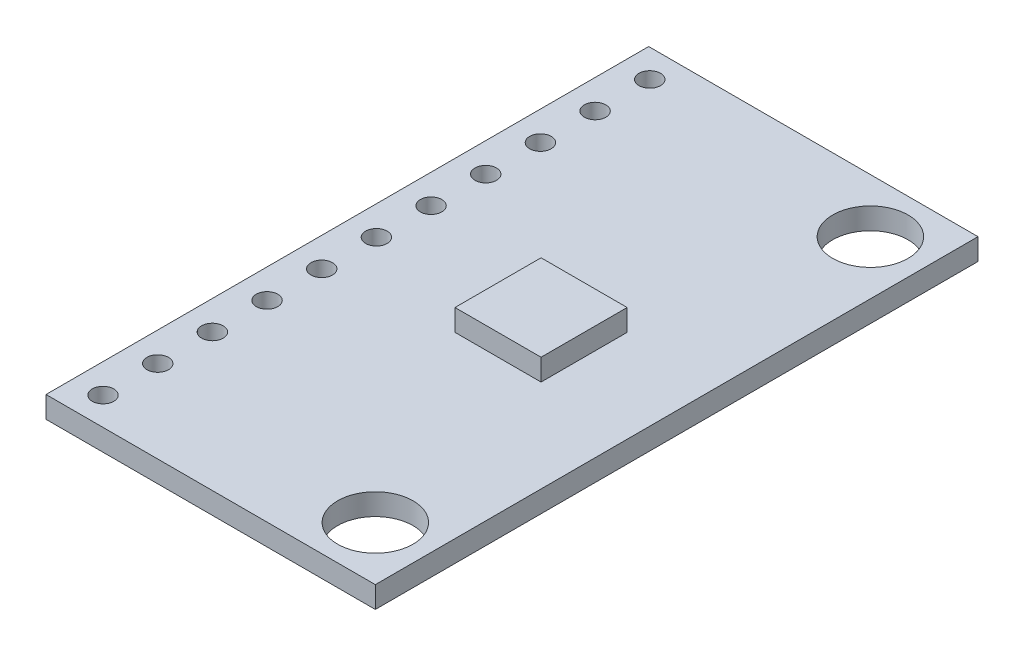
ISO-10303-21;
HEADER;
FILE_DESCRIPTION(('STEP AP214'),'2;1');
FILE_NAME('part.step','',(''),(''),'','','');
FILE_SCHEMA(('AUTOMOTIVE_DESIGN { 1 0 10303 214 1 1 1 1 }'));
ENDSEC;
DATA;
#1=APPLICATION_CONTEXT('core data for automotive mechanical design processes');
#2=APPLICATION_PROTOCOL_DEFINITION('international standard','automotive_design',2000,#1);
#3=PRODUCT_CONTEXT('',#1,'mechanical');
#4=PRODUCT('Part','Part','',(#3));
#5=PRODUCT_RELATED_PRODUCT_CATEGORY('part','',(#4));
#6=PRODUCT_DEFINITION_FORMATION('','',#4);
#7=PRODUCT_DEFINITION_CONTEXT('part definition',#1,'design');
#8=PRODUCT_DEFINITION('design','',#6,#7);
#9=PRODUCT_DEFINITION_SHAPE('','',#8);
#10=(LENGTH_UNIT() NAMED_UNIT(*) SI_UNIT(.MILLI.,.METRE.));
#11=(NAMED_UNIT(*) PLANE_ANGLE_UNIT() SI_UNIT($,.RADIAN.));
#12=(NAMED_UNIT(*) SI_UNIT($,.STERADIAN.) SOLID_ANGLE_UNIT());
#13=UNCERTAINTY_MEASURE_WITH_UNIT(LENGTH_MEASURE(1.E-05),#10,'distance_accuracy_value','');
#14=(GEOMETRIC_REPRESENTATION_CONTEXT(3) GLOBAL_UNCERTAINTY_ASSIGNED_CONTEXT((#13)) GLOBAL_UNIT_ASSIGNED_CONTEXT((#10,
#11,#12)) REPRESENTATION_CONTEXT('',''));
#15=CARTESIAN_POINT('',(0.,0.,0.));
#16=DIRECTION('',(0.,0.,1.));
#17=DIRECTION('',(1.,0.,0.));
#18=AXIS2_PLACEMENT_3D('',#15,#16,#17);
#19=CARTESIAN_POINT('',(0.,1.,0.));
#20=DIRECTION('',(0.,-1.,0.));
#21=DIRECTION('',(0.,0.,-1.));
#22=AXIS2_PLACEMENT_3D('',#19,#20,#21);
#23=PLANE('',#22);
#24=CARTESIAN_POINT('',(-7.65000000000001,1.,2.54));
#25=DIRECTION('',(0.,1.,0.));
#26=DIRECTION('',(0.,0.,-1.));
#27=AXIS2_PLACEMENT_3D('',#24,#25,#26);
#28=CIRCLE('',#27,0.500000000000001);
#29=CARTESIAN_POINT('',(-7.65000000000001,1.,2.04));
#30=VERTEX_POINT('',#29);
#31=EDGE_CURVE('E121',#30,#30,#28,.T.);
#32=ORIENTED_EDGE('',*,*,#31,.F.);
#33=EDGE_LOOP('',(#32));
#34=FACE_BOUND('',#33,.T.);
#35=CARTESIAN_POINT('',(-7.65000000000003,1.,7.62));
#36=DIRECTION('',(0.,1.,0.));
#37=DIRECTION('',(0.,0.,-1.));
#38=AXIS2_PLACEMENT_3D('',#35,#36,#37);
#39=CIRCLE('',#38,0.500000000000001);
#40=CARTESIAN_POINT('',(-7.65000000000003,1.,7.12));
#41=VERTEX_POINT('',#40);
#42=EDGE_CURVE('E136',#41,#41,#39,.T.);
#43=ORIENTED_EDGE('',*,*,#42,.F.);
#44=EDGE_LOOP('',(#43));
#45=FACE_BOUND('',#44,.T.);
#46=CARTESIAN_POINT('',(-7.65000000000005,1.,12.7));
#47=DIRECTION('',(0.,1.,0.));
#48=DIRECTION('',(0.,0.,-1.));
#49=AXIS2_PLACEMENT_3D('',#46,#47,#48);
#50=CIRCLE('',#49,0.500000000000001);
#51=CARTESIAN_POINT('',(-7.65000000000005,1.,12.2));
#52=VERTEX_POINT('',#51);
#53=EDGE_CURVE('E148',#52,#52,#50,.T.);
#54=ORIENTED_EDGE('',*,*,#53,.F.);
#55=EDGE_LOOP('',(#54));
#56=FACE_BOUND('',#55,.T.);
#57=CARTESIAN_POINT('',(-7.65000000000003,1.,-10.16));
#58=DIRECTION('',(0.,1.,0.));
#59=DIRECTION('',(0.,0.,1.));
#60=AXIS2_PLACEMENT_3D('',#57,#58,#59);
#61=CIRCLE('',#60,0.500000000000001);
#62=CARTESIAN_POINT('',(-7.65000000000003,1.,-9.66));
#63=VERTEX_POINT('',#62);
#64=EDGE_CURVE('E160',#63,#63,#61,.T.);
#65=ORIENTED_EDGE('',*,*,#64,.F.);
#66=EDGE_LOOP('',(#65));
#67=FACE_BOUND('',#66,.T.);
#68=CARTESIAN_POINT('',(-7.65000000000002,1.,-5.08));
#69=DIRECTION('',(0.,1.,0.));
#70=DIRECTION('',(0.,0.,1.));
#71=AXIS2_PLACEMENT_3D('',#68,#69,#70);
#72=CIRCLE('',#71,0.500000000000001);
#73=CARTESIAN_POINT('',(-7.65000000000002,1.,-4.58));
#74=VERTEX_POINT('',#73);
#75=EDGE_CURVE('E172',#74,#74,#72,.T.);
#76=ORIENTED_EDGE('',*,*,#75,.F.);
#77=EDGE_LOOP('',(#76));
#78=FACE_BOUND('',#77,.T.);
#79=CARTESIAN_POINT('',(-7.65,1.,0.));
#80=DIRECTION('',(0.,1.,0.));
#81=DIRECTION('',(0.,0.,1.));
#82=AXIS2_PLACEMENT_3D('',#79,#80,#81);
#83=CIRCLE('',#82,0.500000000000001);
#84=CARTESIAN_POINT('',(-7.65,1.,0.500000000000001));
#85=VERTEX_POINT('',#84);
#86=EDGE_CURVE('E184',#85,#85,#83,.T.);
#87=ORIENTED_EDGE('',*,*,#86,.F.);
#88=EDGE_LOOP('',(#87));
#89=FACE_BOUND('',#88,.T.);
#90=CARTESIAN_POINT('',(3.8,1.,-11.5));
#91=DIRECTION('',(0.,1.,0.));
#92=DIRECTION('',(0.,0.,1.));
#93=AXIS2_PLACEMENT_3D('',#90,#91,#92);
#94=CIRCLE('',#93,1.75);
#95=CARTESIAN_POINT('',(3.8,1.,-9.75));
#96=VERTEX_POINT('',#95);
#97=EDGE_CURVE('E196',#96,#96,#94,.T.);
#98=ORIENTED_EDGE('',*,*,#97,.F.);
#99=EDGE_LOOP('',(#98));
#100=FACE_BOUND('',#99,.T.);
#101=DIRECTION('',(0.,0.,-1.));
#102=VECTOR('',#101,1.);
#103=CARTESIAN_POINT('',(6.3,1.,14.));
#104=LINE('',#103,#102);
#105=CARTESIAN_POINT('',(6.3,1.,14.));
#106=VERTEX_POINT('',#105);
#107=CARTESIAN_POINT('',(6.3,1.,-14.));
#108=VERTEX_POINT('',#107);
#109=EDGE_CURVE('E202',#106,#108,#104,.T.);
#110=ORIENTED_EDGE('',*,*,#109,.T.);
#111=DIRECTION('',(-1.,0.,0.));
#112=VECTOR('',#111,1.);
#113=CARTESIAN_POINT('',(-9.,1.,-14.));
#114=LINE('',#113,#112);
#115=CARTESIAN_POINT('',(-9.,1.,-14.));
#116=VERTEX_POINT('',#115);
#117=EDGE_CURVE('E205',#108,#116,#114,.T.);
#118=ORIENTED_EDGE('',*,*,#117,.T.);
#119=DIRECTION('',(0.,0.,1.));
#120=VECTOR('',#119,1.);
#121=CARTESIAN_POINT('',(-9.,1.,14.));
#122=LINE('',#121,#120);
#123=CARTESIAN_POINT('',(-9.,1.,14.));
#124=VERTEX_POINT('',#123);
#125=EDGE_CURVE('E208',#116,#124,#122,.T.);
#126=ORIENTED_EDGE('',*,*,#125,.T.);
#127=DIRECTION('',(1.,0.,0.));
#128=VECTOR('',#127,1.);
#129=CARTESIAN_POINT('',(-9.,1.,14.));
#130=LINE('',#129,#128);
#131=EDGE_CURVE('E210',#124,#106,#130,.T.);
#132=ORIENTED_EDGE('',*,*,#131,.T.);
#133=EDGE_LOOP('',(#110,#118,#126,#132));
#134=FACE_BOUND('',#133,.T.);
#135=CARTESIAN_POINT('',(3.79999999999999,1.,11.5));
#136=DIRECTION('',(0.,1.,0.));
#137=DIRECTION('',(0.,0.,-1.));
#138=AXIS2_PLACEMENT_3D('',#135,#136,#137);
#139=CIRCLE('',#138,1.75);
#140=CARTESIAN_POINT('',(3.79999999999999,1.,9.75));
#141=VERTEX_POINT('',#140);
#142=EDGE_CURVE('E190',#141,#141,#139,.T.);
#143=ORIENTED_EDGE('',*,*,#142,.F.);
#144=EDGE_LOOP('',(#143));
#145=FACE_BOUND('',#144,.T.);
#146=CARTESIAN_POINT('',(-7.65000000000001,1.,-2.54));
#147=DIRECTION('',(0.,1.,0.));
#148=DIRECTION('',(0.,0.,1.));
#149=AXIS2_PLACEMENT_3D('',#146,#147,#148);
#150=CIRCLE('',#149,0.500000000000001);
#151=CARTESIAN_POINT('',(-7.65000000000001,1.,-2.04));
#152=VERTEX_POINT('',#151);
#153=EDGE_CURVE('E178',#152,#152,#150,.T.);
#154=ORIENTED_EDGE('',*,*,#153,.F.);
#155=EDGE_LOOP('',(#154));
#156=FACE_BOUND('',#155,.T.);
#157=CARTESIAN_POINT('',(-7.65000000000003,1.,-7.62));
#158=DIRECTION('',(0.,1.,0.));
#159=DIRECTION('',(0.,0.,1.));
#160=AXIS2_PLACEMENT_3D('',#157,#158,#159);
#161=CIRCLE('',#160,0.500000000000001);
#162=CARTESIAN_POINT('',(-7.65000000000003,1.,-7.12));
#163=VERTEX_POINT('',#162);
#164=EDGE_CURVE('E166',#163,#163,#161,.T.);
#165=ORIENTED_EDGE('',*,*,#164,.F.);
#166=EDGE_LOOP('',(#165));
#167=FACE_BOUND('',#166,.T.);
#168=CARTESIAN_POINT('',(-7.65000000000004,1.,-12.7));
#169=DIRECTION('',(0.,1.,0.));
#170=DIRECTION('',(0.,0.,1.));
#171=AXIS2_PLACEMENT_3D('',#168,#169,#170);
#172=CIRCLE('',#171,0.500000000000001);
#173=CARTESIAN_POINT('',(-7.65000000000004,1.,-12.2));
#174=VERTEX_POINT('',#173);
#175=EDGE_CURVE('E154',#174,#174,#172,.T.);
#176=ORIENTED_EDGE('',*,*,#175,.F.);
#177=EDGE_LOOP('',(#176));
#178=FACE_BOUND('',#177,.T.);
#179=CARTESIAN_POINT('',(-7.65000000000004,1.,10.16));
#180=DIRECTION('',(0.,1.,0.));
#181=DIRECTION('',(0.,0.,-1.));
#182=AXIS2_PLACEMENT_3D('',#179,#180,#181);
#183=CIRCLE('',#182,0.500000000000001);
#184=CARTESIAN_POINT('',(-7.65000000000004,1.,9.66));
#185=VERTEX_POINT('',#184);
#186=EDGE_CURVE('E142',#185,#185,#183,.T.);
#187=ORIENTED_EDGE('',*,*,#186,.F.);
#188=EDGE_LOOP('',(#187));
#189=FACE_BOUND('',#188,.T.);
#190=CARTESIAN_POINT('',(-7.65000000000002,1.,5.08));
#191=DIRECTION('',(0.,1.,0.));
#192=DIRECTION('',(0.,0.,-1.));
#193=AXIS2_PLACEMENT_3D('',#190,#191,#192);
#194=CIRCLE('',#193,0.500000000000001);
#195=CARTESIAN_POINT('',(-7.65000000000002,1.,4.58));
#196=VERTEX_POINT('',#195);
#197=EDGE_CURVE('E130',#196,#196,#194,.T.);
#198=ORIENTED_EDGE('',*,*,#197,.F.);
#199=EDGE_LOOP('',(#198));
#200=FACE_BOUND('',#199,.T.);
#201=DIRECTION('',(0.,0.,-1.));
#202=VECTOR('',#201,1.);
#203=CARTESIAN_POINT('',(2.,1.,-2.));
#204=LINE('',#203,#202);
#205=CARTESIAN_POINT('',(2.,1.,2.));
#206=VERTEX_POINT('',#205);
#207=CARTESIAN_POINT('',(2.,1.,-2.));
#208=VERTEX_POINT('',#207);
#209=EDGE_CURVE('E117',#206,#208,#204,.T.);
#210=ORIENTED_EDGE('',*,*,#209,.F.);
#211=DIRECTION('',(1.,0.,0.));
#212=VECTOR('',#211,1.);
#213=CARTESIAN_POINT('',(-2.,1.,2.));
#214=LINE('',#213,#212);
#215=CARTESIAN_POINT('',(-2.,1.,2.));
#216=VERTEX_POINT('',#215);
#217=EDGE_CURVE('E114',#216,#206,#214,.T.);
#218=ORIENTED_EDGE('',*,*,#217,.F.);
#219=DIRECTION('',(0.,0.,1.));
#220=VECTOR('',#219,1.);
#221=CARTESIAN_POINT('',(-2.,1.,-2.));
#222=LINE('',#221,#220);
#223=CARTESIAN_POINT('',(-2.,1.,-2.));
#224=VERTEX_POINT('',#223);
#225=EDGE_CURVE('E52',#224,#216,#222,.T.);
#226=ORIENTED_EDGE('',*,*,#225,.F.);
#227=DIRECTION('',(-1.,0.,0.));
#228=VECTOR('',#227,1.);
#229=CARTESIAN_POINT('',(-2.,1.,-2.));
#230=LINE('',#229,#228);
#231=EDGE_CURVE('E47',#208,#224,#230,.T.);
#232=ORIENTED_EDGE('',*,*,#231,.F.);
#233=EDGE_LOOP('',(#210,#218,#226,#232));
#234=FACE_BOUND('',#233,.T.);
#235=ADVANCED_FACE('F32',(#34,#45,#56,#67,#78,#89,#100,#134,#145,#156,#167,#178,#189,#200,#234),
#23,.F.);
#236=CARTESIAN_POINT('',(0.,0.,0.));
#237=DIRECTION('',(0.,-1.,0.));
#238=DIRECTION('',(0.,0.,-1.));
#239=AXIS2_PLACEMENT_3D('',#236,#237,#238);
#240=PLANE('',#239);
#241=CARTESIAN_POINT('',(-7.65000000000002,0.,5.08));
#242=DIRECTION('',(0.,1.,0.));
#243=DIRECTION('',(0.,0.,-1.));
#244=AXIS2_PLACEMENT_3D('',#241,#242,#243);
#245=CIRCLE('',#244,0.500000000000001);
#246=CARTESIAN_POINT('',(-7.65000000000002,0.,4.58));
#247=VERTEX_POINT('',#246);
#248=EDGE_CURVE('E128',#247,#247,#245,.T.);
#249=ORIENTED_EDGE('',*,*,#248,.T.);
#250=EDGE_LOOP('',(#249));
#251=FACE_BOUND('',#250,.T.);
#252=CARTESIAN_POINT('',(-7.65000000000004,0.,10.16));
#253=DIRECTION('',(0.,1.,0.));
#254=DIRECTION('',(0.,0.,-1.));
#255=AXIS2_PLACEMENT_3D('',#252,#253,#254);
#256=CIRCLE('',#255,0.500000000000001);
#257=CARTESIAN_POINT('',(-7.65000000000004,0.,9.66));
#258=VERTEX_POINT('',#257);
#259=EDGE_CURVE('E139',#258,#258,#256,.T.);
#260=ORIENTED_EDGE('',*,*,#259,.T.);
#261=EDGE_LOOP('',(#260));
#262=FACE_BOUND('',#261,.T.);
#263=CARTESIAN_POINT('',(-7.65000000000004,0.,-12.7));
#264=DIRECTION('',(0.,1.,0.));
#265=DIRECTION('',(0.,0.,1.));
#266=AXIS2_PLACEMENT_3D('',#263,#264,#265);
#267=CIRCLE('',#266,0.500000000000001);
#268=CARTESIAN_POINT('',(-7.65000000000004,0.,-12.2));
#269=VERTEX_POINT('',#268);
#270=EDGE_CURVE('E151',#269,#269,#267,.T.);
#271=ORIENTED_EDGE('',*,*,#270,.T.);
#272=EDGE_LOOP('',(#271));
#273=FACE_BOUND('',#272,.T.);
#274=CARTESIAN_POINT('',(-7.65000000000003,0.,-7.62));
#275=DIRECTION('',(0.,1.,0.));
#276=DIRECTION('',(0.,0.,1.));
#277=AXIS2_PLACEMENT_3D('',#274,#275,#276);
#278=CIRCLE('',#277,0.500000000000001);
#279=CARTESIAN_POINT('',(-7.65000000000003,0.,-7.12));
#280=VERTEX_POINT('',#279);
#281=EDGE_CURVE('E163',#280,#280,#278,.T.);
#282=ORIENTED_EDGE('',*,*,#281,.T.);
#283=EDGE_LOOP('',(#282));
#284=FACE_BOUND('',#283,.T.);
#285=CARTESIAN_POINT('',(-7.65000000000001,0.,-2.54));
#286=DIRECTION('',(0.,1.,0.));
#287=DIRECTION('',(0.,0.,1.));
#288=AXIS2_PLACEMENT_3D('',#285,#286,#287);
#289=CIRCLE('',#288,0.500000000000001);
#290=CARTESIAN_POINT('',(-7.65000000000001,0.,-2.04));
#291=VERTEX_POINT('',#290);
#292=EDGE_CURVE('E175',#291,#291,#289,.T.);
#293=ORIENTED_EDGE('',*,*,#292,.T.);
#294=EDGE_LOOP('',(#293));
#295=FACE_BOUND('',#294,.T.);
#296=CARTESIAN_POINT('',(3.79999999999999,0.,11.5));
#297=DIRECTION('',(0.,1.,0.));
#298=DIRECTION('',(0.,0.,-1.));
#299=AXIS2_PLACEMENT_3D('',#296,#297,#298);
#300=CIRCLE('',#299,1.75);
#301=CARTESIAN_POINT('',(3.79999999999999,0.,9.75));
#302=VERTEX_POINT('',#301);
#303=EDGE_CURVE('E187',#302,#302,#300,.T.);
#304=ORIENTED_EDGE('',*,*,#303,.T.);
#305=EDGE_LOOP('',(#304));
#306=FACE_BOUND('',#305,.T.);
#307=DIRECTION('',(0.,0.,-1.));
#308=VECTOR('',#307,1.);
#309=CARTESIAN_POINT('',(6.3,0.,14.));
#310=LINE('',#309,#308);
#311=CARTESIAN_POINT('',(6.3,0.,14.));
#312=VERTEX_POINT('',#311);
#313=CARTESIAN_POINT('',(6.3,0.,-14.));
#314=VERTEX_POINT('',#313);
#315=EDGE_CURVE('E199',#312,#314,#310,.T.);
#316=ORIENTED_EDGE('',*,*,#315,.F.);
#317=DIRECTION('',(1.,0.,0.));
#318=VECTOR('',#317,1.);
#319=CARTESIAN_POINT('',(-9.,0.,14.));
#320=LINE('',#319,#318);
#321=CARTESIAN_POINT('',(-9.,0.,14.));
#322=VERTEX_POINT('',#321);
#323=EDGE_CURVE('E206',#322,#312,#320,.T.);
#324=ORIENTED_EDGE('',*,*,#323,.F.);
#325=DIRECTION('',(0.,0.,1.));
#326=VECTOR('',#325,1.);
#327=CARTESIAN_POINT('',(-9.,0.,14.));
#328=LINE('',#327,#326);
#329=CARTESIAN_POINT('',(-9.,0.,-14.));
#330=VERTEX_POINT('',#329);
#331=EDGE_CURVE('E217',#330,#322,#328,.T.);
#332=ORIENTED_EDGE('',*,*,#331,.F.);
#333=DIRECTION('',(-1.,0.,0.));
#334=VECTOR('',#333,1.);
#335=CARTESIAN_POINT('',(-9.,0.,-14.));
#336=LINE('',#335,#334);
#337=EDGE_CURVE('E215',#314,#330,#336,.T.);
#338=ORIENTED_EDGE('',*,*,#337,.F.);
#339=EDGE_LOOP('',(#316,#324,#332,#338));
#340=FACE_BOUND('',#339,.T.);
#341=CARTESIAN_POINT('',(3.8,0.,-11.5));
#342=DIRECTION('',(0.,1.,0.));
#343=DIRECTION('',(0.,0.,1.));
#344=AXIS2_PLACEMENT_3D('',#341,#342,#343);
#345=CIRCLE('',#344,1.75);
#346=CARTESIAN_POINT('',(3.8,0.,-9.75));
#347=VERTEX_POINT('',#346);
#348=EDGE_CURVE('E193',#347,#347,#345,.T.);
#349=ORIENTED_EDGE('',*,*,#348,.T.);
#350=EDGE_LOOP('',(#349));
#351=FACE_BOUND('',#350,.T.);
#352=CARTESIAN_POINT('',(-7.65,0.,0.));
#353=DIRECTION('',(0.,1.,0.));
#354=DIRECTION('',(0.,0.,1.));
#355=AXIS2_PLACEMENT_3D('',#352,#353,#354);
#356=CIRCLE('',#355,0.500000000000001);
#357=CARTESIAN_POINT('',(-7.65,0.,0.500000000000001));
#358=VERTEX_POINT('',#357);
#359=EDGE_CURVE('E181',#358,#358,#356,.T.);
#360=ORIENTED_EDGE('',*,*,#359,.T.);
#361=EDGE_LOOP('',(#360));
#362=FACE_BOUND('',#361,.T.);
#363=CARTESIAN_POINT('',(-7.65000000000002,0.,-5.08));
#364=DIRECTION('',(0.,1.,0.));
#365=DIRECTION('',(0.,0.,1.));
#366=AXIS2_PLACEMENT_3D('',#363,#364,#365);
#367=CIRCLE('',#366,0.500000000000001);
#368=CARTESIAN_POINT('',(-7.65000000000002,0.,-4.58));
#369=VERTEX_POINT('',#368);
#370=EDGE_CURVE('E169',#369,#369,#367,.T.);
#371=ORIENTED_EDGE('',*,*,#370,.T.);
#372=EDGE_LOOP('',(#371));
#373=FACE_BOUND('',#372,.T.);
#374=CARTESIAN_POINT('',(-7.65000000000003,0.,-10.16));
#375=DIRECTION('',(0.,1.,0.));
#376=DIRECTION('',(0.,0.,1.));
#377=AXIS2_PLACEMENT_3D('',#374,#375,#376);
#378=CIRCLE('',#377,0.500000000000001);
#379=CARTESIAN_POINT('',(-7.65000000000003,0.,-9.66));
#380=VERTEX_POINT('',#379);
#381=EDGE_CURVE('E157',#380,#380,#378,.T.);
#382=ORIENTED_EDGE('',*,*,#381,.T.);
#383=EDGE_LOOP('',(#382));
#384=FACE_BOUND('',#383,.T.);
#385=CARTESIAN_POINT('',(-7.65000000000005,0.,12.7));
#386=DIRECTION('',(0.,1.,0.));
#387=DIRECTION('',(0.,0.,-1.));
#388=AXIS2_PLACEMENT_3D('',#385,#386,#387);
#389=CIRCLE('',#388,0.500000000000001);
#390=CARTESIAN_POINT('',(-7.65000000000005,0.,12.2));
#391=VERTEX_POINT('',#390);
#392=EDGE_CURVE('E145',#391,#391,#389,.T.);
#393=ORIENTED_EDGE('',*,*,#392,.T.);
#394=EDGE_LOOP('',(#393));
#395=FACE_BOUND('',#394,.T.);
#396=CARTESIAN_POINT('',(-7.65000000000003,0.,7.62));
#397=DIRECTION('',(0.,1.,0.));
#398=DIRECTION('',(0.,0.,-1.));
#399=AXIS2_PLACEMENT_3D('',#396,#397,#398);
#400=CIRCLE('',#399,0.500000000000001);
#401=CARTESIAN_POINT('',(-7.65000000000003,0.,7.12));
#402=VERTEX_POINT('',#401);
#403=EDGE_CURVE('E133',#402,#402,#400,.T.);
#404=ORIENTED_EDGE('',*,*,#403,.T.);
#405=EDGE_LOOP('',(#404));
#406=FACE_BOUND('',#405,.T.);
#407=CARTESIAN_POINT('',(-7.65000000000001,0.,2.54));
#408=DIRECTION('',(0.,1.,0.));
#409=DIRECTION('',(0.,0.,-1.));
#410=AXIS2_PLACEMENT_3D('',#407,#408,#409);
#411=CIRCLE('',#410,0.500000000000001);
#412=CARTESIAN_POINT('',(-7.65000000000001,0.,2.04));
#413=VERTEX_POINT('',#412);
#414=EDGE_CURVE('E118',#413,#413,#411,.T.);
#415=ORIENTED_EDGE('',*,*,#414,.T.);
#416=EDGE_LOOP('',(#415));
#417=FACE_BOUND('',#416,.T.);
#418=ADVANCED_FACE('F235',(#251,#262,#273,#284,#295,#306,#340,#351,#362,#373,#384,#395,#406,
#417),#240,.T.);
#419=CARTESIAN_POINT('',(6.3,1.,14.));
#420=DIRECTION('',(-1.,0.,0.));
#421=DIRECTION('',(0.,0.,1.));
#422=AXIS2_PLACEMENT_3D('',#419,#420,#421);
#423=PLANE('',#422);
#424=ORIENTED_EDGE('',*,*,#315,.T.);
#425=DIRECTION('',(0.,-1.,0.));
#426=VECTOR('',#425,1.);
#427=CARTESIAN_POINT('',(6.3,1.,-14.));
#428=LINE('',#427,#426);
#429=EDGE_CURVE('E11',#108,#314,#428,.T.);
#430=ORIENTED_EDGE('',*,*,#429,.F.);
#431=ORIENTED_EDGE('',*,*,#109,.F.);
#432=DIRECTION('',(0.,-1.,0.));
#433=VECTOR('',#432,1.);
#434=CARTESIAN_POINT('',(6.3,1.,14.));
#435=LINE('',#434,#433);
#436=EDGE_CURVE('E212',#106,#312,#435,.T.);
#437=ORIENTED_EDGE('',*,*,#436,.T.);
#438=EDGE_LOOP('',(#424,#430,#431,#437));
#439=FACE_BOUND('',#438,.T.);
#440=ADVANCED_FACE('F34',(#439),#423,.F.);
#441=CARTESIAN_POINT('',(-9.,1.,-14.));
#442=DIRECTION('',(0.,0.,1.));
#443=DIRECTION('',(1.,0.,0.));
#444=AXIS2_PLACEMENT_3D('',#441,#442,#443);
#445=PLANE('',#444);
#446=ORIENTED_EDGE('',*,*,#337,.T.);
#447=DIRECTION('',(0.,-1.,0.));
#448=VECTOR('',#447,1.);
#449=CARTESIAN_POINT('',(-9.,1.,-14.));
#450=LINE('',#449,#448);
#451=EDGE_CURVE('E40',#116,#330,#450,.T.);
#452=ORIENTED_EDGE('',*,*,#451,.F.);
#453=ORIENTED_EDGE('',*,*,#117,.F.);
#454=ORIENTED_EDGE('',*,*,#429,.T.);
#455=EDGE_LOOP('',(#446,#452,#453,#454));
#456=FACE_BOUND('',#455,.T.);
#457=ADVANCED_FACE('F246',(#456),#445,.F.);
#458=CARTESIAN_POINT('',(-9.,1.,14.));
#459=DIRECTION('',(1.,0.,0.));
#460=DIRECTION('',(0.,0.,-1.));
#461=AXIS2_PLACEMENT_3D('',#458,#459,#460);
#462=PLANE('',#461);
#463=ORIENTED_EDGE('',*,*,#331,.T.);
#464=DIRECTION('',(0.,-1.,0.));
#465=VECTOR('',#464,1.);
#466=CARTESIAN_POINT('',(-9.,1.,14.));
#467=LINE('',#466,#465);
#468=EDGE_CURVE('E222',#124,#322,#467,.T.);
#469=ORIENTED_EDGE('',*,*,#468,.F.);
#470=ORIENTED_EDGE('',*,*,#125,.F.);
#471=ORIENTED_EDGE('',*,*,#451,.T.);
#472=EDGE_LOOP('',(#463,#469,#470,#471));
#473=FACE_BOUND('',#472,.T.);
#474=ADVANCED_FACE('F229',(#473),#462,.F.);
#475=CARTESIAN_POINT('',(-9.,1.,14.));
#476=DIRECTION('',(0.,0.,-1.));
#477=DIRECTION('',(-1.,0.,0.));
#478=AXIS2_PLACEMENT_3D('',#475,#476,#477);
#479=PLANE('',#478);
#480=ORIENTED_EDGE('',*,*,#323,.T.);
#481=ORIENTED_EDGE('',*,*,#436,.F.);
#482=ORIENTED_EDGE('',*,*,#131,.F.);
#483=ORIENTED_EDGE('',*,*,#468,.T.);
#484=EDGE_LOOP('',(#480,#481,#482,#483));
#485=FACE_BOUND('',#484,.T.);
#486=ADVANCED_FACE('F239',(#485),#479,.F.);
#487=CARTESIAN_POINT('',(3.8,1.,-11.5));
#488=DIRECTION('',(0.,-1.,0.));
#489=DIRECTION('',(0.,0.,-1.));
#490=AXIS2_PLACEMENT_3D('',#487,#488,#489);
#491=CYLINDRICAL_SURFACE('',#490,1.75);
#492=ORIENTED_EDGE('',*,*,#97,.T.);
#493=EDGE_LOOP('',(#492));
#494=FACE_BOUND('',#493,.T.);
#495=ORIENTED_EDGE('',*,*,#348,.F.);
#496=EDGE_LOOP('',(#495));
#497=FACE_BOUND('',#496,.T.);
#498=ADVANCED_FACE('F264',(#494,#497),#491,.F.);
#499=CARTESIAN_POINT('',(3.79999999999999,1.,11.5));
#500=DIRECTION('',(0.,-1.,0.));
#501=DIRECTION('',(0.,0.,-1.));
#502=AXIS2_PLACEMENT_3D('',#499,#500,#501);
#503=CYLINDRICAL_SURFACE('',#502,1.75);
#504=ORIENTED_EDGE('',*,*,#142,.T.);
#505=EDGE_LOOP('',(#504));
#506=FACE_BOUND('',#505,.T.);
#507=ORIENTED_EDGE('',*,*,#303,.F.);
#508=EDGE_LOOP('',(#507));
#509=FACE_BOUND('',#508,.T.);
#510=ADVANCED_FACE('F271',(#506,#509),#503,.F.);
#511=CARTESIAN_POINT('',(-7.65,1.,0.));
#512=DIRECTION('',(0.,-1.,0.));
#513=DIRECTION('',(0.,0.,-1.));
#514=AXIS2_PLACEMENT_3D('',#511,#512,#513);
#515=CYLINDRICAL_SURFACE('',#514,0.500000000000001);
#516=ORIENTED_EDGE('',*,*,#86,.T.);
#517=EDGE_LOOP('',(#516));
#518=FACE_BOUND('',#517,.T.);
#519=ORIENTED_EDGE('',*,*,#359,.F.);
#520=EDGE_LOOP('',(#519));
#521=FACE_BOUND('',#520,.T.);
#522=ADVANCED_FACE('F276',(#518,#521),#515,.F.);
#523=CARTESIAN_POINT('',(-7.65000000000001,1.,-2.54));
#524=DIRECTION('',(0.,-1.,0.));
#525=DIRECTION('',(0.,0.,-1.));
#526=AXIS2_PLACEMENT_3D('',#523,#524,#525);
#527=CYLINDRICAL_SURFACE('',#526,0.500000000000001);
#528=ORIENTED_EDGE('',*,*,#153,.T.);
#529=EDGE_LOOP('',(#528));
#530=FACE_BOUND('',#529,.T.);
#531=ORIENTED_EDGE('',*,*,#292,.F.);
#532=EDGE_LOOP('',(#531));
#533=FACE_BOUND('',#532,.T.);
#534=ADVANCED_FACE('F335',(#530,#533),#527,.F.);
#535=CARTESIAN_POINT('',(-7.65000000000002,1.,-5.08));
#536=DIRECTION('',(0.,-1.,0.));
#537=DIRECTION('',(0.,0.,-1.));
#538=AXIS2_PLACEMENT_3D('',#535,#536,#537);
#539=CYLINDRICAL_SURFACE('',#538,0.500000000000001);
#540=ORIENTED_EDGE('',*,*,#75,.T.);
#541=EDGE_LOOP('',(#540));
#542=FACE_BOUND('',#541,.T.);
#543=ORIENTED_EDGE('',*,*,#370,.F.);
#544=EDGE_LOOP('',(#543));
#545=FACE_BOUND('',#544,.T.);
#546=ADVANCED_FACE('F331',(#542,#545),#539,.F.);
#547=CARTESIAN_POINT('',(-7.65000000000003,1.,-7.62));
#548=DIRECTION('',(0.,-1.,0.));
#549=DIRECTION('',(0.,0.,-1.));
#550=AXIS2_PLACEMENT_3D('',#547,#548,#549);
#551=CYLINDRICAL_SURFACE('',#550,0.500000000000001);
#552=ORIENTED_EDGE('',*,*,#164,.T.);
#553=EDGE_LOOP('',(#552));
#554=FACE_BOUND('',#553,.T.);
#555=ORIENTED_EDGE('',*,*,#281,.F.);
#556=EDGE_LOOP('',(#555));
#557=FACE_BOUND('',#556,.T.);
#558=ADVANCED_FACE('F327',(#554,#557),#551,.F.);
#559=CARTESIAN_POINT('',(-7.65000000000003,1.,-10.16));
#560=DIRECTION('',(0.,-1.,0.));
#561=DIRECTION('',(0.,0.,-1.));
#562=AXIS2_PLACEMENT_3D('',#559,#560,#561);
#563=CYLINDRICAL_SURFACE('',#562,0.500000000000001);
#564=ORIENTED_EDGE('',*,*,#64,.T.);
#565=EDGE_LOOP('',(#564));
#566=FACE_BOUND('',#565,.T.);
#567=ORIENTED_EDGE('',*,*,#381,.F.);
#568=EDGE_LOOP('',(#567));
#569=FACE_BOUND('',#568,.T.);
#570=ADVANCED_FACE('F323',(#566,#569),#563,.F.);
#571=CARTESIAN_POINT('',(-7.65000000000004,1.,-12.7));
#572=DIRECTION('',(0.,-1.,0.));
#573=DIRECTION('',(0.,0.,-1.));
#574=AXIS2_PLACEMENT_3D('',#571,#572,#573);
#575=CYLINDRICAL_SURFACE('',#574,0.500000000000001);
#576=ORIENTED_EDGE('',*,*,#175,.T.);
#577=EDGE_LOOP('',(#576));
#578=FACE_BOUND('',#577,.T.);
#579=ORIENTED_EDGE('',*,*,#270,.F.);
#580=EDGE_LOOP('',(#579));
#581=FACE_BOUND('',#580,.T.);
#582=ADVANCED_FACE('F319',(#578,#581),#575,.F.);
#583=CARTESIAN_POINT('',(-7.65000000000005,1.,12.7));
#584=DIRECTION('',(0.,-1.,0.));
#585=DIRECTION('',(0.,0.,-1.));
#586=AXIS2_PLACEMENT_3D('',#583,#584,#585);
#587=CYLINDRICAL_SURFACE('',#586,0.500000000000001);
#588=ORIENTED_EDGE('',*,*,#53,.T.);
#589=EDGE_LOOP('',(#588));
#590=FACE_BOUND('',#589,.T.);
#591=ORIENTED_EDGE('',*,*,#392,.F.);
#592=EDGE_LOOP('',(#591));
#593=FACE_BOUND('',#592,.T.);
#594=ADVANCED_FACE('F315',(#590,#593),#587,.F.);
#595=CARTESIAN_POINT('',(-7.65000000000004,1.,10.16));
#596=DIRECTION('',(0.,-1.,0.));
#597=DIRECTION('',(0.,0.,-1.));
#598=AXIS2_PLACEMENT_3D('',#595,#596,#597);
#599=CYLINDRICAL_SURFACE('',#598,0.500000000000001);
#600=ORIENTED_EDGE('',*,*,#186,.T.);
#601=EDGE_LOOP('',(#600));
#602=FACE_BOUND('',#601,.T.);
#603=ORIENTED_EDGE('',*,*,#259,.F.);
#604=EDGE_LOOP('',(#603));
#605=FACE_BOUND('',#604,.T.);
#606=ADVANCED_FACE('F311',(#602,#605),#599,.F.);
#607=CARTESIAN_POINT('',(-7.65000000000003,1.,7.62));
#608=DIRECTION('',(0.,-1.,0.));
#609=DIRECTION('',(0.,0.,-1.));
#610=AXIS2_PLACEMENT_3D('',#607,#608,#609);
#611=CYLINDRICAL_SURFACE('',#610,0.500000000000001);
#612=ORIENTED_EDGE('',*,*,#42,.T.);
#613=EDGE_LOOP('',(#612));
#614=FACE_BOUND('',#613,.T.);
#615=ORIENTED_EDGE('',*,*,#403,.F.);
#616=EDGE_LOOP('',(#615));
#617=FACE_BOUND('',#616,.T.);
#618=ADVANCED_FACE('F304',(#614,#617),#611,.F.);
#619=CARTESIAN_POINT('',(-7.65000000000002,1.,5.08));
#620=DIRECTION('',(0.,-1.,0.));
#621=DIRECTION('',(0.,0.,-1.));
#622=AXIS2_PLACEMENT_3D('',#619,#620,#621);
#623=CYLINDRICAL_SURFACE('',#622,0.500000000000001);
#624=ORIENTED_EDGE('',*,*,#197,.T.);
#625=EDGE_LOOP('',(#624));
#626=FACE_BOUND('',#625,.T.);
#627=ORIENTED_EDGE('',*,*,#248,.F.);
#628=EDGE_LOOP('',(#627));
#629=FACE_BOUND('',#628,.T.);
#630=ADVANCED_FACE('F296',(#626,#629),#623,.F.);
#631=CARTESIAN_POINT('',(-7.65000000000001,1.,2.54));
#632=DIRECTION('',(0.,-1.,0.));
#633=DIRECTION('',(0.,0.,-1.));
#634=AXIS2_PLACEMENT_3D('',#631,#632,#633);
#635=CYLINDRICAL_SURFACE('',#634,0.500000000000001);
#636=ORIENTED_EDGE('',*,*,#31,.T.);
#637=EDGE_LOOP('',(#636));
#638=FACE_BOUND('',#637,.T.);
#639=ORIENTED_EDGE('',*,*,#414,.F.);
#640=EDGE_LOOP('',(#639));
#641=FACE_BOUND('',#640,.T.);
#642=ADVANCED_FACE('F294',(#638,#641),#635,.F.);
#643=CARTESIAN_POINT('',(2.,2.,-2.));
#644=DIRECTION('',(-1.,0.,0.));
#645=DIRECTION('',(0.,0.,1.));
#646=AXIS2_PLACEMENT_3D('',#643,#644,#645);
#647=PLANE('',#646);
#648=ORIENTED_EDGE('',*,*,#209,.T.);
#649=DIRECTION('',(0.,-1.,0.));
#650=VECTOR('',#649,1.);
#651=CARTESIAN_POINT('',(2.,2.,-2.));
#652=LINE('',#651,#650);
#653=CARTESIAN_POINT('',(2.,2.,-2.));
#654=VERTEX_POINT('',#653);
#655=EDGE_CURVE('E98',#654,#208,#652,.T.);
#656=ORIENTED_EDGE('',*,*,#655,.F.);
#657=DIRECTION('',(0.,0.,-1.));
#658=VECTOR('',#657,1.);
#659=CARTESIAN_POINT('',(2.,2.,-2.));
#660=LINE('',#659,#658);
#661=CARTESIAN_POINT('',(2.,2.,2.));
#662=VERTEX_POINT('',#661);
#663=EDGE_CURVE('E105',#662,#654,#660,.T.);
#664=ORIENTED_EDGE('',*,*,#663,.F.);
#665=DIRECTION('',(0.,-1.,0.));
#666=VECTOR('',#665,1.);
#667=CARTESIAN_POINT('',(2.,2.,2.));
#668=LINE('',#667,#666);
#669=EDGE_CURVE('E441',#662,#206,#668,.T.);
#670=ORIENTED_EDGE('',*,*,#669,.T.);
#671=EDGE_LOOP('',(#648,#656,#664,#670));
#672=FACE_BOUND('',#671,.T.);
#673=ADVANCED_FACE('F116',(#672),#647,.F.);
#674=CARTESIAN_POINT('',(-2.,2.,-2.));
#675=DIRECTION('',(0.,0.,1.));
#676=DIRECTION('',(1.,0.,0.));
#677=AXIS2_PLACEMENT_3D('',#674,#675,#676);
#678=PLANE('',#677);
#679=ORIENTED_EDGE('',*,*,#231,.T.);
#680=DIRECTION('',(0.,-1.,0.));
#681=VECTOR('',#680,1.);
#682=CARTESIAN_POINT('',(-2.,2.,-2.));
#683=LINE('',#682,#681);
#684=CARTESIAN_POINT('',(-2.,2.,-2.));
#685=VERTEX_POINT('',#684);
#686=EDGE_CURVE('E101',#685,#224,#683,.T.);
#687=ORIENTED_EDGE('',*,*,#686,.F.);
#688=DIRECTION('',(-1.,0.,0.));
#689=VECTOR('',#688,1.);
#690=CARTESIAN_POINT('',(-2.,2.,-2.));
#691=LINE('',#690,#689);
#692=EDGE_CURVE('E94',#654,#685,#691,.T.);
#693=ORIENTED_EDGE('',*,*,#692,.F.);
#694=ORIENTED_EDGE('',*,*,#655,.T.);
#695=EDGE_LOOP('',(#679,#687,#693,#694));
#696=FACE_BOUND('',#695,.T.);
#697=ADVANCED_FACE('F96',(#696),#678,.F.);
#698=CARTESIAN_POINT('',(-2.,2.,-2.));
#699=DIRECTION('',(1.,0.,0.));
#700=DIRECTION('',(0.,0.,-1.));
#701=AXIS2_PLACEMENT_3D('',#698,#699,#700);
#702=PLANE('',#701);
#703=ORIENTED_EDGE('',*,*,#225,.T.);
#704=DIRECTION('',(0.,-1.,0.));
#705=VECTOR('',#704,1.);
#706=CARTESIAN_POINT('',(-2.,2.,2.));
#707=LINE('',#706,#705);
#708=CARTESIAN_POINT('',(-2.,2.,2.));
#709=VERTEX_POINT('',#708);
#710=EDGE_CURVE('E123',#709,#216,#707,.T.);
#711=ORIENTED_EDGE('',*,*,#710,.F.);
#712=DIRECTION('',(0.,0.,1.));
#713=VECTOR('',#712,1.);
#714=CARTESIAN_POINT('',(-2.,2.,-2.));
#715=LINE('',#714,#713);
#716=EDGE_CURVE('E104',#685,#709,#715,.T.);
#717=ORIENTED_EDGE('',*,*,#716,.F.);
#718=ORIENTED_EDGE('',*,*,#686,.T.);
#719=EDGE_LOOP('',(#703,#711,#717,#718));
#720=FACE_BOUND('',#719,.T.);
#721=ADVANCED_FACE('F409',(#720),#702,.F.);
#722=CARTESIAN_POINT('',(-2.,2.,2.));
#723=DIRECTION('',(0.,0.,-1.));
#724=DIRECTION('',(-1.,0.,0.));
#725=AXIS2_PLACEMENT_3D('',#722,#723,#724);
#726=PLANE('',#725);
#727=ORIENTED_EDGE('',*,*,#217,.T.);
#728=ORIENTED_EDGE('',*,*,#669,.F.);
#729=DIRECTION('',(1.,0.,0.));
#730=VECTOR('',#729,1.);
#731=CARTESIAN_POINT('',(-2.,2.,2.));
#732=LINE('',#731,#730);
#733=EDGE_CURVE('E110',#709,#662,#732,.T.);
#734=ORIENTED_EDGE('',*,*,#733,.F.);
#735=ORIENTED_EDGE('',*,*,#710,.T.);
#736=EDGE_LOOP('',(#727,#728,#734,#735));
#737=FACE_BOUND('',#736,.T.);
#738=ADVANCED_FACE('F417',(#737),#726,.F.);
#739=CARTESIAN_POINT('',(0.,2.,0.));
#740=DIRECTION('',(0.,1.,0.));
#741=DIRECTION('',(0.,0.,1.));
#742=AXIS2_PLACEMENT_3D('',#739,#740,#741);
#743=PLANE('',#742);
#744=ORIENTED_EDGE('',*,*,#663,.T.);
#745=ORIENTED_EDGE('',*,*,#692,.T.);
#746=ORIENTED_EDGE('',*,*,#716,.T.);
#747=ORIENTED_EDGE('',*,*,#733,.T.);
#748=EDGE_LOOP('',(#744,#745,#746,#747));
#749=FACE_BOUND('',#748,.T.);
#750=ADVANCED_FACE('F108',(#749),#743,.T.);
#751=CLOSED_SHELL('',(#235,#418,#440,#457,#474,#486,#498,#510,#522,#534,#546,#558,#570,#582,
#594,#606,#618,#630,#642,#673,#697,#721,#738,#750));
#752=MANIFOLD_SOLID_BREP('B2',#751);
#753=ADVANCED_BREP_SHAPE_REPRESENTATION('',(#18,#752),#14);
#754=SHAPE_DEFINITION_REPRESENTATION(#9,#753);
ENDSEC;
END-ISO-10303-21;
